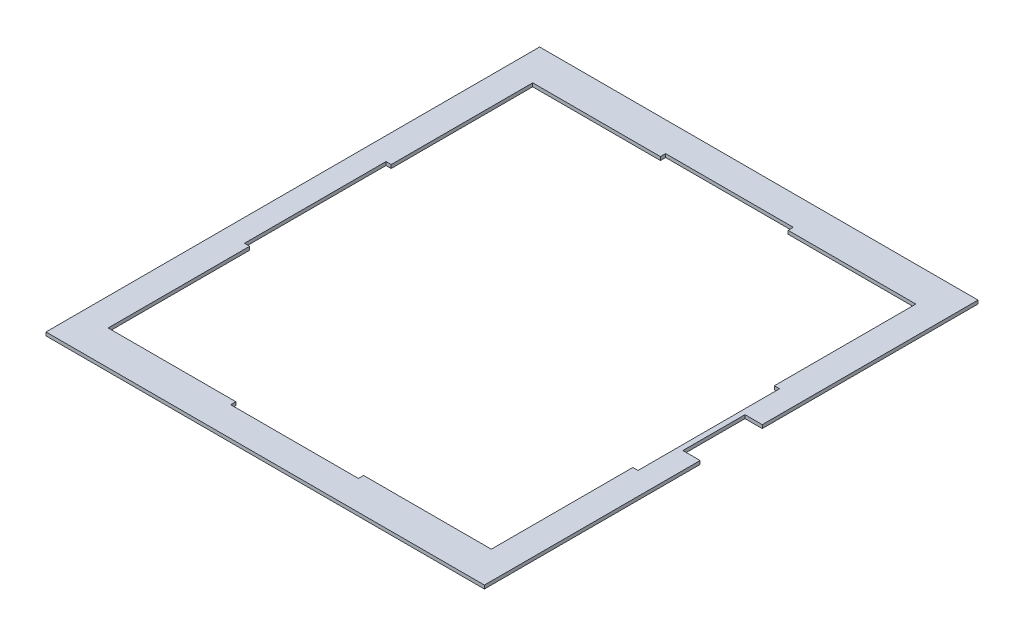
ISO-10303-21;
HEADER;
FILE_DESCRIPTION(('STEP AP214'),'2;1');
FILE_NAME('part.step','',(''),(''),'','','');
FILE_SCHEMA(('AUTOMOTIVE_DESIGN { 1 0 10303 214 1 1 1 1 }'));
ENDSEC;
DATA;
#1=APPLICATION_CONTEXT('core data for automotive mechanical design processes');
#2=APPLICATION_PROTOCOL_DEFINITION('international standard','automotive_design',2000,#1);
#3=PRODUCT_CONTEXT('',#1,'mechanical');
#4=PRODUCT('Part','Part','',(#3));
#5=PRODUCT_RELATED_PRODUCT_CATEGORY('part','',(#4));
#6=PRODUCT_DEFINITION_FORMATION('','',#4);
#7=PRODUCT_DEFINITION_CONTEXT('part definition',#1,'design');
#8=PRODUCT_DEFINITION('design','',#6,#7);
#9=PRODUCT_DEFINITION_SHAPE('','',#8);
#10=(LENGTH_UNIT() NAMED_UNIT(*) SI_UNIT(.MILLI.,.METRE.));
#11=(NAMED_UNIT(*) PLANE_ANGLE_UNIT() SI_UNIT($,.RADIAN.));
#12=(NAMED_UNIT(*) SI_UNIT($,.STERADIAN.) SOLID_ANGLE_UNIT());
#13=UNCERTAINTY_MEASURE_WITH_UNIT(LENGTH_MEASURE(1.E-05),#10,'distance_accuracy_value','');
#14=(GEOMETRIC_REPRESENTATION_CONTEXT(3) GLOBAL_UNCERTAINTY_ASSIGNED_CONTEXT((#13)) GLOBAL_UNIT_ASSIGNED_CONTEXT((#10,
#11,#12)) REPRESENTATION_CONTEXT('',''));
#15=CARTESIAN_POINT('',(0.,0.,0.));
#16=DIRECTION('',(0.,0.,1.));
#17=DIRECTION('',(1.,0.,0.));
#18=AXIS2_PLACEMENT_3D('',#15,#16,#17);
#19=CARTESIAN_POINT('',(0.,2.,0.));
#20=DIRECTION('',(0.,-1.,0.));
#21=DIRECTION('',(0.,0.,-1.));
#22=AXIS2_PLACEMENT_3D('',#19,#20,#21);
#23=PLANE('',#22);
#24=DIRECTION('',(0.,0.,-1.));
#25=VECTOR('',#24,1.);
#26=CARTESIAN_POINT('',(127.,2.,-18.));
#27=LINE('',#26,#25);
#28=CARTESIAN_POINT('',(127.,2.,-18.));
#29=VERTEX_POINT('',#28);
#30=CARTESIAN_POINT('',(127.,2.,-143.));
#31=VERTEX_POINT('',#30);
#32=EDGE_CURVE('E367',#29,#31,#27,.T.);
#33=ORIENTED_EDGE('',*,*,#32,.T.);
#34=DIRECTION('',(-1.,0.,0.));
#35=VECTOR('',#34,1.);
#36=CARTESIAN_POINT('',(-127.,2.,-143.));
#37=LINE('',#36,#35);
#38=CARTESIAN_POINT('',(-127.,2.,-143.));
#39=VERTEX_POINT('',#38);
#40=EDGE_CURVE('E370',#31,#39,#37,.T.);
#41=ORIENTED_EDGE('',*,*,#40,.T.);
#42=DIRECTION('',(0.,0.,1.));
#43=VECTOR('',#42,1.);
#44=CARTESIAN_POINT('',(-127.,2.,143.));
#45=LINE('',#44,#43);
#46=CARTESIAN_POINT('',(-127.,2.,143.));
#47=VERTEX_POINT('',#46);
#48=EDGE_CURVE('E373',#39,#47,#45,.T.);
#49=ORIENTED_EDGE('',*,*,#48,.T.);
#50=DIRECTION('',(1.,0.,0.));
#51=VECTOR('',#50,1.);
#52=CARTESIAN_POINT('',(-127.,2.,143.));
#53=LINE('',#52,#51);
#54=CARTESIAN_POINT('',(127.,2.,143.));
#55=VERTEX_POINT('',#54);
#56=EDGE_CURVE('E375',#47,#55,#53,.T.);
#57=ORIENTED_EDGE('',*,*,#56,.T.);
#58=DIRECTION('',(0.,0.,-1.));
#59=VECTOR('',#58,1.);
#60=CARTESIAN_POINT('',(127.,2.,143.));
#61=LINE('',#60,#59);
#62=CARTESIAN_POINT('',(127.,2.,18.));
#63=VERTEX_POINT('',#62);
#64=EDGE_CURVE('E377',#55,#63,#61,.T.);
#65=ORIENTED_EDGE('',*,*,#64,.T.);
#66=DIRECTION('',(-1.,0.,0.));
#67=VECTOR('',#66,1.);
#68=CARTESIAN_POINT('',(127.,2.,18.));
#69=LINE('',#68,#67);
#70=CARTESIAN_POINT('',(117.,2.,18.));
#71=VERTEX_POINT('',#70);
#72=EDGE_CURVE('E379',#63,#71,#69,.T.);
#73=ORIENTED_EDGE('',*,*,#72,.T.);
#74=DIRECTION('',(0.,0.,-1.));
#75=VECTOR('',#74,1.);
#76=CARTESIAN_POINT('',(117.,2.,18.));
#77=LINE('',#76,#75);
#78=CARTESIAN_POINT('',(117.,2.,-18.));
#79=VERTEX_POINT('',#78);
#80=EDGE_CURVE('E381',#71,#79,#77,.T.);
#81=ORIENTED_EDGE('',*,*,#80,.T.);
#82=DIRECTION('',(1.,0.,0.));
#83=VECTOR('',#82,1.);
#84=CARTESIAN_POINT('',(127.,2.,-18.));
#85=LINE('',#84,#83);
#86=EDGE_CURVE('E383',#79,#29,#85,.T.);
#87=ORIENTED_EDGE('',*,*,#86,.T.);
#88=EDGE_LOOP('',(#33,#41,#49,#57,#65,#73,#81,#87));
#89=FACE_BOUND('',#88,.T.);
#90=DIRECTION('',(0.,0.,-1.));
#91=VECTOR('',#90,1.);
#92=CARTESIAN_POINT('',(111.,2.,-41.));
#93=LINE('',#92,#91);
#94=CARTESIAN_POINT('',(111.,2.,-41.));
#95=VERTEX_POINT('',#94);
#96=CARTESIAN_POINT('',(111.,2.,-123.));
#97=VERTEX_POINT('',#96);
#98=EDGE_CURVE('E218',#95,#97,#93,.T.);
#99=ORIENTED_EDGE('',*,*,#98,.F.);
#100=DIRECTION('',(-1.,0.,0.));
#101=VECTOR('',#100,1.);
#102=CARTESIAN_POINT('',(111.,2.,-41.));
#103=LINE('',#102,#101);
#104=CARTESIAN_POINT('',(114.,2.,-41.));
#105=VERTEX_POINT('',#104);
#106=EDGE_CURVE('E275',#105,#95,#103,.T.);
#107=ORIENTED_EDGE('',*,*,#106,.F.);
#108=DIRECTION('',(0.,0.,-1.));
#109=VECTOR('',#108,1.);
#110=CARTESIAN_POINT('',(114.,2.,41.));
#111=LINE('',#110,#109);
#112=CARTESIAN_POINT('',(114.,2.,41.));
#113=VERTEX_POINT('',#112);
#114=EDGE_CURVE('E273',#113,#105,#111,.T.);
#115=ORIENTED_EDGE('',*,*,#114,.F.);
#116=DIRECTION('',(1.,0.,0.));
#117=VECTOR('',#116,1.);
#118=CARTESIAN_POINT('',(111.,2.,41.));
#119=LINE('',#118,#117);
#120=CARTESIAN_POINT('',(111.,2.,41.));
#121=VERTEX_POINT('',#120);
#122=EDGE_CURVE('E271',#121,#113,#119,.T.);
#123=ORIENTED_EDGE('',*,*,#122,.F.);
#124=DIRECTION('',(0.,0.,-1.));
#125=VECTOR('',#124,1.);
#126=CARTESIAN_POINT('',(111.,2.,123.));
#127=LINE('',#126,#125);
#128=CARTESIAN_POINT('',(111.,2.,123.));
#129=VERTEX_POINT('',#128);
#130=EDGE_CURVE('E269',#129,#121,#127,.T.);
#131=ORIENTED_EDGE('',*,*,#130,.F.);
#132=DIRECTION('',(1.,0.,0.));
#133=VECTOR('',#132,1.);
#134=CARTESIAN_POINT('',(37.,2.,123.));
#135=LINE('',#134,#133);
#136=CARTESIAN_POINT('',(37.,2.,123.));
#137=VERTEX_POINT('',#136);
#138=EDGE_CURVE('E267',#137,#129,#135,.T.);
#139=ORIENTED_EDGE('',*,*,#138,.F.);
#140=DIRECTION('',(0.,0.,-1.));
#141=VECTOR('',#140,1.);
#142=CARTESIAN_POINT('',(37.,2.,123.));
#143=LINE('',#142,#141);
#144=CARTESIAN_POINT('',(37.,2.,126.));
#145=VERTEX_POINT('',#144);
#146=EDGE_CURVE('E265',#145,#137,#143,.T.);
#147=ORIENTED_EDGE('',*,*,#146,.F.);
#148=DIRECTION('',(1.,0.,0.));
#149=VECTOR('',#148,1.);
#150=CARTESIAN_POINT('',(37.,2.,126.));
#151=LINE('',#150,#149);
#152=CARTESIAN_POINT('',(-37.,2.,126.));
#153=VERTEX_POINT('',#152);
#154=EDGE_CURVE('E263',#153,#145,#151,.T.);
#155=ORIENTED_EDGE('',*,*,#154,.F.);
#156=DIRECTION('',(0.,0.,1.));
#157=VECTOR('',#156,1.);
#158=CARTESIAN_POINT('',(-37.,2.,123.));
#159=LINE('',#158,#157);
#160=CARTESIAN_POINT('',(-37.,2.,123.));
#161=VERTEX_POINT('',#160);
#162=EDGE_CURVE('E261',#161,#153,#159,.T.);
#163=ORIENTED_EDGE('',*,*,#162,.F.);
#164=DIRECTION('',(1.,0.,0.));
#165=VECTOR('',#164,1.);
#166=CARTESIAN_POINT('',(-111.,2.,123.));
#167=LINE('',#166,#165);
#168=CARTESIAN_POINT('',(-111.,2.,123.));
#169=VERTEX_POINT('',#168);
#170=EDGE_CURVE('E259',#169,#161,#167,.T.);
#171=ORIENTED_EDGE('',*,*,#170,.F.);
#172=DIRECTION('',(0.,0.,1.));
#173=VECTOR('',#172,1.);
#174=CARTESIAN_POINT('',(-111.,2.,123.));
#175=LINE('',#174,#173);
#176=CARTESIAN_POINT('',(-111.,2.,41.));
#177=VERTEX_POINT('',#176);
#178=EDGE_CURVE('E257',#177,#169,#175,.T.);
#179=ORIENTED_EDGE('',*,*,#178,.F.);
#180=DIRECTION('',(1.,0.,0.));
#181=VECTOR('',#180,1.);
#182=CARTESIAN_POINT('',(-111.,2.,41.));
#183=LINE('',#182,#181);
#184=CARTESIAN_POINT('',(-114.,2.,41.));
#185=VERTEX_POINT('',#184);
#186=EDGE_CURVE('E255',#185,#177,#183,.T.);
#187=ORIENTED_EDGE('',*,*,#186,.F.);
#188=DIRECTION('',(0.,0.,1.));
#189=VECTOR('',#188,1.);
#190=CARTESIAN_POINT('',(-114.,2.,41.));
#191=LINE('',#190,#189);
#192=CARTESIAN_POINT('',(-114.,2.,-41.));
#193=VERTEX_POINT('',#192);
#194=EDGE_CURVE('E253',#193,#185,#191,.T.);
#195=ORIENTED_EDGE('',*,*,#194,.F.);
#196=DIRECTION('',(-1.,0.,0.));
#197=VECTOR('',#196,1.);
#198=CARTESIAN_POINT('',(-111.,2.,-41.));
#199=LINE('',#198,#197);
#200=CARTESIAN_POINT('',(-111.,2.,-41.));
#201=VERTEX_POINT('',#200);
#202=EDGE_CURVE('E251',#201,#193,#199,.T.);
#203=ORIENTED_EDGE('',*,*,#202,.F.);
#204=DIRECTION('',(0.,0.,1.));
#205=VECTOR('',#204,1.);
#206=CARTESIAN_POINT('',(-111.,2.,-41.));
#207=LINE('',#206,#205);
#208=CARTESIAN_POINT('',(-111.,2.,-123.));
#209=VERTEX_POINT('',#208);
#210=EDGE_CURVE('E249',#209,#201,#207,.T.);
#211=ORIENTED_EDGE('',*,*,#210,.F.);
#212=DIRECTION('',(-1.,0.,0.));
#213=VECTOR('',#212,1.);
#214=CARTESIAN_POINT('',(-111.,2.,-123.));
#215=LINE('',#214,#213);
#216=CARTESIAN_POINT('',(-37.,2.,-123.));
#217=VERTEX_POINT('',#216);
#218=EDGE_CURVE('E247',#217,#209,#215,.T.);
#219=ORIENTED_EDGE('',*,*,#218,.F.);
#220=DIRECTION('',(0.,0.,1.));
#221=VECTOR('',#220,1.);
#222=CARTESIAN_POINT('',(-37.,2.,-123.));
#223=LINE('',#222,#221);
#224=CARTESIAN_POINT('',(-37.,2.,-126.));
#225=VERTEX_POINT('',#224);
#226=EDGE_CURVE('E245',#225,#217,#223,.T.);
#227=ORIENTED_EDGE('',*,*,#226,.F.);
#228=DIRECTION('',(-1.,0.,0.));
#229=VECTOR('',#228,1.);
#230=CARTESIAN_POINT('',(37.,2.,-126.));
#231=LINE('',#230,#229);
#232=CARTESIAN_POINT('',(37.,2.,-126.));
#233=VERTEX_POINT('',#232);
#234=EDGE_CURVE('E241',#233,#225,#231,.T.);
#235=ORIENTED_EDGE('',*,*,#234,.F.);
#236=DIRECTION('',(0.,0.,-1.));
#237=VECTOR('',#236,1.);
#238=CARTESIAN_POINT('',(37.,2.,-123.));
#239=LINE('',#238,#237);
#240=CARTESIAN_POINT('',(37.,2.,-123.));
#241=VERTEX_POINT('',#240);
#242=EDGE_CURVE('E239',#241,#233,#239,.T.);
#243=ORIENTED_EDGE('',*,*,#242,.F.);
#244=DIRECTION('',(-1.,0.,0.));
#245=VECTOR('',#244,1.);
#246=CARTESIAN_POINT('',(37.,2.,-123.));
#247=LINE('',#246,#245);
#248=EDGE_CURVE('E226',#97,#241,#247,.T.);
#249=ORIENTED_EDGE('',*,*,#248,.F.);
#250=EDGE_LOOP('',(#99,#107,#115,#123,#131,#139,#147,#155,#163,#171,#179,#187,#195,#203,#211,
#219,#227,#235,#243,#249));
#251=FACE_BOUND('',#250,.T.);
#252=ADVANCED_FACE('F33',(#89,#251),#23,.F.);
#253=CARTESIAN_POINT('',(0.,0.,0.));
#254=DIRECTION('',(0.,-1.,0.));
#255=DIRECTION('',(0.,0.,-1.));
#256=AXIS2_PLACEMENT_3D('',#253,#254,#255);
#257=PLANE('',#256);
#258=DIRECTION('',(0.,0.,-1.));
#259=VECTOR('',#258,1.);
#260=CARTESIAN_POINT('',(127.,0.,-18.));
#261=LINE('',#260,#259);
#262=CARTESIAN_POINT('',(127.,0.,-18.));
#263=VERTEX_POINT('',#262);
#264=CARTESIAN_POINT('',(127.,0.,-143.));
#265=VERTEX_POINT('',#264);
#266=EDGE_CURVE('E234',#263,#265,#261,.T.);
#267=ORIENTED_EDGE('',*,*,#266,.F.);
#268=DIRECTION('',(1.,0.,0.));
#269=VECTOR('',#268,1.);
#270=CARTESIAN_POINT('',(127.,0.,-18.));
#271=LINE('',#270,#269);
#272=CARTESIAN_POINT('',(117.,0.,-18.));
#273=VERTEX_POINT('',#272);
#274=EDGE_CURVE('E371',#273,#263,#271,.T.);
#275=ORIENTED_EDGE('',*,*,#274,.F.);
#276=DIRECTION('',(0.,0.,-1.));
#277=VECTOR('',#276,1.);
#278=CARTESIAN_POINT('',(117.,0.,18.));
#279=LINE('',#278,#277);
#280=CARTESIAN_POINT('',(117.,0.,18.));
#281=VERTEX_POINT('',#280);
#282=EDGE_CURVE('E398',#281,#273,#279,.T.);
#283=ORIENTED_EDGE('',*,*,#282,.F.);
#284=DIRECTION('',(-1.,0.,0.));
#285=VECTOR('',#284,1.);
#286=CARTESIAN_POINT('',(127.,0.,18.));
#287=LINE('',#286,#285);
#288=CARTESIAN_POINT('',(127.,0.,18.));
#289=VERTEX_POINT('',#288);
#290=EDGE_CURVE('E396',#289,#281,#287,.T.);
#291=ORIENTED_EDGE('',*,*,#290,.F.);
#292=DIRECTION('',(0.,0.,-1.));
#293=VECTOR('',#292,1.);
#294=CARTESIAN_POINT('',(127.,0.,143.));
#295=LINE('',#294,#293);
#296=CARTESIAN_POINT('',(127.,0.,143.));
#297=VERTEX_POINT('',#296);
#298=EDGE_CURVE('E394',#297,#289,#295,.T.);
#299=ORIENTED_EDGE('',*,*,#298,.F.);
#300=DIRECTION('',(1.,0.,0.));
#301=VECTOR('',#300,1.);
#302=CARTESIAN_POINT('',(-127.,0.,143.));
#303=LINE('',#302,#301);
#304=CARTESIAN_POINT('',(-127.,0.,143.));
#305=VERTEX_POINT('',#304);
#306=EDGE_CURVE('E392',#305,#297,#303,.T.);
#307=ORIENTED_EDGE('',*,*,#306,.F.);
#308=DIRECTION('',(0.,0.,1.));
#309=VECTOR('',#308,1.);
#310=CARTESIAN_POINT('',(-127.,0.,143.));
#311=LINE('',#310,#309);
#312=CARTESIAN_POINT('',(-127.,0.,-143.));
#313=VERTEX_POINT('',#312);
#314=EDGE_CURVE('E390',#313,#305,#311,.T.);
#315=ORIENTED_EDGE('',*,*,#314,.F.);
#316=DIRECTION('',(-1.,0.,0.));
#317=VECTOR('',#316,1.);
#318=CARTESIAN_POINT('',(-127.,0.,-143.));
#319=LINE('',#318,#317);
#320=EDGE_CURVE('E388',#265,#313,#319,.T.);
#321=ORIENTED_EDGE('',*,*,#320,.F.);
#322=EDGE_LOOP('',(#267,#275,#283,#291,#299,#307,#315,#321));
#323=FACE_BOUND('',#322,.T.);
#324=DIRECTION('',(-1.,0.,0.));
#325=VECTOR('',#324,1.);
#326=CARTESIAN_POINT('',(111.,0.,-41.));
#327=LINE('',#326,#325);
#328=CARTESIAN_POINT('',(114.,0.,-41.));
#329=VERTEX_POINT('',#328);
#330=CARTESIAN_POINT('',(111.,0.,-41.));
#331=VERTEX_POINT('',#330);
#332=EDGE_CURVE('E227',#329,#331,#327,.T.);
#333=ORIENTED_EDGE('',*,*,#332,.T.);
#334=DIRECTION('',(0.,0.,-1.));
#335=VECTOR('',#334,1.);
#336=CARTESIAN_POINT('',(111.,0.,-41.));
#337=LINE('',#336,#335);
#338=CARTESIAN_POINT('',(111.,0.,-123.));
#339=VERTEX_POINT('',#338);
#340=EDGE_CURVE('E56',#331,#339,#337,.T.);
#341=ORIENTED_EDGE('',*,*,#340,.T.);
#342=DIRECTION('',(-1.,0.,0.));
#343=VECTOR('',#342,1.);
#344=CARTESIAN_POINT('',(37.,0.,-123.));
#345=LINE('',#344,#343);
#346=CARTESIAN_POINT('',(37.,0.,-123.));
#347=VERTEX_POINT('',#346);
#348=EDGE_CURVE('E233',#339,#347,#345,.T.);
#349=ORIENTED_EDGE('',*,*,#348,.T.);
#350=DIRECTION('',(0.,0.,-1.));
#351=VECTOR('',#350,1.);
#352=CARTESIAN_POINT('',(37.,0.,-123.));
#353=LINE('',#352,#351);
#354=CARTESIAN_POINT('',(37.,0.,-126.));
#355=VERTEX_POINT('',#354);
#356=EDGE_CURVE('E279',#347,#355,#353,.T.);
#357=ORIENTED_EDGE('',*,*,#356,.T.);
#358=DIRECTION('',(-1.,0.,0.));
#359=VECTOR('',#358,1.);
#360=CARTESIAN_POINT('',(37.,0.,-126.));
#361=LINE('',#360,#359);
#362=CARTESIAN_POINT('',(-37.,0.,-126.));
#363=VERTEX_POINT('',#362);
#364=EDGE_CURVE('E282',#355,#363,#361,.T.);
#365=ORIENTED_EDGE('',*,*,#364,.T.);
#366=DIRECTION('',(0.,0.,1.));
#367=VECTOR('',#366,1.);
#368=CARTESIAN_POINT('',(-37.,0.,-123.));
#369=LINE('',#368,#367);
#370=CARTESIAN_POINT('',(-37.,0.,-123.));
#371=VERTEX_POINT('',#370);
#372=EDGE_CURVE('E285',#363,#371,#369,.T.);
#373=ORIENTED_EDGE('',*,*,#372,.T.);
#374=DIRECTION('',(-1.,0.,0.));
#375=VECTOR('',#374,1.);
#376=CARTESIAN_POINT('',(-111.,0.,-123.));
#377=LINE('',#376,#375);
#378=CARTESIAN_POINT('',(-111.,0.,-123.));
#379=VERTEX_POINT('',#378);
#380=EDGE_CURVE('E288',#371,#379,#377,.T.);
#381=ORIENTED_EDGE('',*,*,#380,.T.);
#382=DIRECTION('',(0.,0.,1.));
#383=VECTOR('',#382,1.);
#384=CARTESIAN_POINT('',(-111.,0.,-41.));
#385=LINE('',#384,#383);
#386=CARTESIAN_POINT('',(-111.,0.,-41.));
#387=VERTEX_POINT('',#386);
#388=EDGE_CURVE('E291',#379,#387,#385,.T.);
#389=ORIENTED_EDGE('',*,*,#388,.T.);
#390=DIRECTION('',(-1.,0.,0.));
#391=VECTOR('',#390,1.);
#392=CARTESIAN_POINT('',(-111.,0.,-41.));
#393=LINE('',#392,#391);
#394=CARTESIAN_POINT('',(-114.,0.,-41.));
#395=VERTEX_POINT('',#394);
#396=EDGE_CURVE('E294',#387,#395,#393,.T.);
#397=ORIENTED_EDGE('',*,*,#396,.T.);
#398=DIRECTION('',(0.,0.,1.));
#399=VECTOR('',#398,1.);
#400=CARTESIAN_POINT('',(-114.,0.,41.));
#401=LINE('',#400,#399);
#402=CARTESIAN_POINT('',(-114.,0.,41.));
#403=VERTEX_POINT('',#402);
#404=EDGE_CURVE('E297',#395,#403,#401,.T.);
#405=ORIENTED_EDGE('',*,*,#404,.T.);
#406=DIRECTION('',(1.,0.,0.));
#407=VECTOR('',#406,1.);
#408=CARTESIAN_POINT('',(-111.,0.,41.));
#409=LINE('',#408,#407);
#410=CARTESIAN_POINT('',(-111.,0.,41.));
#411=VERTEX_POINT('',#410);
#412=EDGE_CURVE('E300',#403,#411,#409,.T.);
#413=ORIENTED_EDGE('',*,*,#412,.T.);
#414=DIRECTION('',(0.,0.,1.));
#415=VECTOR('',#414,1.);
#416=CARTESIAN_POINT('',(-111.,0.,123.));
#417=LINE('',#416,#415);
#418=CARTESIAN_POINT('',(-111.,0.,123.));
#419=VERTEX_POINT('',#418);
#420=EDGE_CURVE('E303',#411,#419,#417,.T.);
#421=ORIENTED_EDGE('',*,*,#420,.T.);
#422=DIRECTION('',(1.,0.,0.));
#423=VECTOR('',#422,1.);
#424=CARTESIAN_POINT('',(-111.,0.,123.));
#425=LINE('',#424,#423);
#426=CARTESIAN_POINT('',(-37.,0.,123.));
#427=VERTEX_POINT('',#426);
#428=EDGE_CURVE('E306',#419,#427,#425,.T.);
#429=ORIENTED_EDGE('',*,*,#428,.T.);
#430=DIRECTION('',(0.,0.,1.));
#431=VECTOR('',#430,1.);
#432=CARTESIAN_POINT('',(-37.,0.,123.));
#433=LINE('',#432,#431);
#434=CARTESIAN_POINT('',(-37.,0.,126.));
#435=VERTEX_POINT('',#434);
#436=EDGE_CURVE('E309',#427,#435,#433,.T.);
#437=ORIENTED_EDGE('',*,*,#436,.T.);
#438=DIRECTION('',(1.,0.,0.));
#439=VECTOR('',#438,1.);
#440=CARTESIAN_POINT('',(37.,0.,126.));
#441=LINE('',#440,#439);
#442=CARTESIAN_POINT('',(37.,0.,126.));
#443=VERTEX_POINT('',#442);
#444=EDGE_CURVE('E312',#435,#443,#441,.T.);
#445=ORIENTED_EDGE('',*,*,#444,.T.);
#446=DIRECTION('',(0.,0.,-1.));
#447=VECTOR('',#446,1.);
#448=CARTESIAN_POINT('',(37.,0.,123.));
#449=LINE('',#448,#447);
#450=CARTESIAN_POINT('',(37.,0.,123.));
#451=VERTEX_POINT('',#450);
#452=EDGE_CURVE('E315',#443,#451,#449,.T.);
#453=ORIENTED_EDGE('',*,*,#452,.T.);
#454=DIRECTION('',(1.,0.,0.));
#455=VECTOR('',#454,1.);
#456=CARTESIAN_POINT('',(37.,0.,123.));
#457=LINE('',#456,#455);
#458=CARTESIAN_POINT('',(111.,0.,123.));
#459=VERTEX_POINT('',#458);
#460=EDGE_CURVE('E318',#451,#459,#457,.T.);
#461=ORIENTED_EDGE('',*,*,#460,.T.);
#462=DIRECTION('',(0.,0.,-1.));
#463=VECTOR('',#462,1.);
#464=CARTESIAN_POINT('',(111.,0.,123.));
#465=LINE('',#464,#463);
#466=CARTESIAN_POINT('',(111.,0.,41.));
#467=VERTEX_POINT('',#466);
#468=EDGE_CURVE('E321',#459,#467,#465,.T.);
#469=ORIENTED_EDGE('',*,*,#468,.T.);
#470=DIRECTION('',(1.,0.,0.));
#471=VECTOR('',#470,1.);
#472=CARTESIAN_POINT('',(111.,0.,41.));
#473=LINE('',#472,#471);
#474=CARTESIAN_POINT('',(114.,0.,41.));
#475=VERTEX_POINT('',#474);
#476=EDGE_CURVE('E324',#467,#475,#473,.T.);
#477=ORIENTED_EDGE('',*,*,#476,.T.);
#478=DIRECTION('',(0.,0.,-1.));
#479=VECTOR('',#478,1.);
#480=CARTESIAN_POINT('',(114.,0.,41.));
#481=LINE('',#480,#479);
#482=EDGE_CURVE('E327',#475,#329,#481,.T.);
#483=ORIENTED_EDGE('',*,*,#482,.T.);
#484=EDGE_LOOP('',(#333,#341,#349,#357,#365,#373,#381,#389,#397,#405,#413,#421,#429,#437,#445,
#453,#461,#469,#477,#483));
#485=FACE_BOUND('',#484,.T.);
#486=ADVANCED_FACE('F428',(#323,#485),#257,.T.);
#487=CARTESIAN_POINT('',(127.,2.,-18.));
#488=DIRECTION('',(-1.,0.,0.));
#489=DIRECTION('',(0.,0.,1.));
#490=AXIS2_PLACEMENT_3D('',#487,#488,#489);
#491=PLANE('',#490);
#492=ORIENTED_EDGE('',*,*,#266,.T.);
#493=DIRECTION('',(0.,-1.,0.));
#494=VECTOR('',#493,1.);
#495=CARTESIAN_POINT('',(127.,2.,-143.));
#496=LINE('',#495,#494);
#497=EDGE_CURVE('E11',#31,#265,#496,.T.);
#498=ORIENTED_EDGE('',*,*,#497,.F.);
#499=ORIENTED_EDGE('',*,*,#32,.F.);
#500=DIRECTION('',(0.,-1.,0.));
#501=VECTOR('',#500,1.);
#502=CARTESIAN_POINT('',(127.,2.,-18.));
#503=LINE('',#502,#501);
#504=EDGE_CURVE('E385',#29,#263,#503,.T.);
#505=ORIENTED_EDGE('',*,*,#504,.T.);
#506=EDGE_LOOP('',(#492,#498,#499,#505));
#507=FACE_BOUND('',#506,.T.);
#508=ADVANCED_FACE('F35',(#507),#491,.F.);
#509=CARTESIAN_POINT('',(-127.,2.,-143.));
#510=DIRECTION('',(0.,0.,1.));
#511=DIRECTION('',(1.,0.,0.));
#512=AXIS2_PLACEMENT_3D('',#509,#510,#511);
#513=PLANE('',#512);
#514=ORIENTED_EDGE('',*,*,#320,.T.);
#515=DIRECTION('',(0.,-1.,0.));
#516=VECTOR('',#515,1.);
#517=CARTESIAN_POINT('',(-127.,2.,-143.));
#518=LINE('',#517,#516);
#519=EDGE_CURVE('E41',#39,#313,#518,.T.);
#520=ORIENTED_EDGE('',*,*,#519,.F.);
#521=ORIENTED_EDGE('',*,*,#40,.F.);
#522=ORIENTED_EDGE('',*,*,#497,.T.);
#523=EDGE_LOOP('',(#514,#520,#521,#522));
#524=FACE_BOUND('',#523,.T.);
#525=ADVANCED_FACE('F445',(#524),#513,.F.);
#526=CARTESIAN_POINT('',(-127.,2.,143.));
#527=DIRECTION('',(1.,0.,0.));
#528=DIRECTION('',(0.,0.,-1.));
#529=AXIS2_PLACEMENT_3D('',#526,#527,#528);
#530=PLANE('',#529);
#531=ORIENTED_EDGE('',*,*,#314,.T.);
#532=DIRECTION('',(0.,-1.,0.));
#533=VECTOR('',#532,1.);
#534=CARTESIAN_POINT('',(-127.,2.,143.));
#535=LINE('',#534,#533);
#536=EDGE_CURVE('E415',#47,#305,#535,.T.);
#537=ORIENTED_EDGE('',*,*,#536,.F.);
#538=ORIENTED_EDGE('',*,*,#48,.F.);
#539=ORIENTED_EDGE('',*,*,#519,.T.);
#540=EDGE_LOOP('',(#531,#537,#538,#539));
#541=FACE_BOUND('',#540,.T.);
#542=ADVANCED_FACE('F422',(#541),#530,.F.);
#543=CARTESIAN_POINT('',(-127.,2.,143.));
#544=DIRECTION('',(0.,0.,-1.));
#545=DIRECTION('',(-1.,0.,0.));
#546=AXIS2_PLACEMENT_3D('',#543,#544,#545);
#547=PLANE('',#546);
#548=ORIENTED_EDGE('',*,*,#306,.T.);
#549=DIRECTION('',(0.,-1.,0.));
#550=VECTOR('',#549,1.);
#551=CARTESIAN_POINT('',(127.,2.,143.));
#552=LINE('',#551,#550);
#553=EDGE_CURVE('E412',#55,#297,#552,.T.);
#554=ORIENTED_EDGE('',*,*,#553,.F.);
#555=ORIENTED_EDGE('',*,*,#56,.F.);
#556=ORIENTED_EDGE('',*,*,#536,.T.);
#557=EDGE_LOOP('',(#548,#554,#555,#556));
#558=FACE_BOUND('',#557,.T.);
#559=ADVANCED_FACE('F434',(#558),#547,.F.);
#560=CARTESIAN_POINT('',(127.,2.,143.));
#561=DIRECTION('',(-1.,0.,0.));
#562=DIRECTION('',(0.,0.,1.));
#563=AXIS2_PLACEMENT_3D('',#560,#561,#562);
#564=PLANE('',#563);
#565=ORIENTED_EDGE('',*,*,#298,.T.);
#566=DIRECTION('',(0.,-1.,0.));
#567=VECTOR('',#566,1.);
#568=CARTESIAN_POINT('',(127.,2.,18.));
#569=LINE('',#568,#567);
#570=EDGE_CURVE('E409',#63,#289,#569,.T.);
#571=ORIENTED_EDGE('',*,*,#570,.F.);
#572=ORIENTED_EDGE('',*,*,#64,.F.);
#573=ORIENTED_EDGE('',*,*,#553,.T.);
#574=EDGE_LOOP('',(#565,#571,#572,#573));
#575=FACE_BOUND('',#574,.T.);
#576=ADVANCED_FACE('F438',(#575),#564,.F.);
#577=CARTESIAN_POINT('',(127.,2.,18.));
#578=DIRECTION('',(0.,0.,1.));
#579=DIRECTION('',(1.,0.,0.));
#580=AXIS2_PLACEMENT_3D('',#577,#578,#579);
#581=PLANE('',#580);
#582=ORIENTED_EDGE('',*,*,#290,.T.);
#583=DIRECTION('',(0.,-1.,0.));
#584=VECTOR('',#583,1.);
#585=CARTESIAN_POINT('',(117.,2.,18.));
#586=LINE('',#585,#584);
#587=EDGE_CURVE('E406',#71,#281,#586,.T.);
#588=ORIENTED_EDGE('',*,*,#587,.F.);
#589=ORIENTED_EDGE('',*,*,#72,.F.);
#590=ORIENTED_EDGE('',*,*,#570,.T.);
#591=EDGE_LOOP('',(#582,#588,#589,#590));
#592=FACE_BOUND('',#591,.T.);
#593=ADVANCED_FACE('F458',(#592),#581,.F.);
#594=CARTESIAN_POINT('',(117.,2.,18.));
#595=DIRECTION('',(-1.,0.,0.));
#596=DIRECTION('',(0.,0.,1.));
#597=AXIS2_PLACEMENT_3D('',#594,#595,#596);
#598=PLANE('',#597);
#599=ORIENTED_EDGE('',*,*,#282,.T.);
#600=DIRECTION('',(0.,-1.,0.));
#601=VECTOR('',#600,1.);
#602=CARTESIAN_POINT('',(117.,2.,-18.));
#603=LINE('',#602,#601);
#604=EDGE_CURVE('E403',#79,#273,#603,.T.);
#605=ORIENTED_EDGE('',*,*,#604,.F.);
#606=ORIENTED_EDGE('',*,*,#80,.F.);
#607=ORIENTED_EDGE('',*,*,#587,.T.);
#608=EDGE_LOOP('',(#599,#605,#606,#607));
#609=FACE_BOUND('',#608,.T.);
#610=ADVANCED_FACE('F456',(#609),#598,.F.);
#611=CARTESIAN_POINT('',(127.,2.,-18.));
#612=DIRECTION('',(0.,0.,-1.));
#613=DIRECTION('',(-1.,0.,0.));
#614=AXIS2_PLACEMENT_3D('',#611,#612,#613);
#615=PLANE('',#614);
#616=ORIENTED_EDGE('',*,*,#274,.T.);
#617=ORIENTED_EDGE('',*,*,#504,.F.);
#618=ORIENTED_EDGE('',*,*,#86,.F.);
#619=ORIENTED_EDGE('',*,*,#604,.T.);
#620=EDGE_LOOP('',(#616,#617,#618,#619));
#621=FACE_BOUND('',#620,.T.);
#622=ADVANCED_FACE('F451',(#621),#615,.F.);
#623=CARTESIAN_POINT('',(111.,2.,-41.));
#624=DIRECTION('',(-1.,0.,0.));
#625=DIRECTION('',(0.,0.,1.));
#626=AXIS2_PLACEMENT_3D('',#623,#624,#625);
#627=PLANE('',#626);
#628=ORIENTED_EDGE('',*,*,#340,.F.);
#629=DIRECTION('',(0.,-1.,0.));
#630=VECTOR('',#629,1.);
#631=CARTESIAN_POINT('',(111.,2.,-41.));
#632=LINE('',#631,#630);
#633=EDGE_CURVE('E222',#95,#331,#632,.T.);
#634=ORIENTED_EDGE('',*,*,#633,.F.);
#635=ORIENTED_EDGE('',*,*,#98,.T.);
#636=DIRECTION('',(0.,-1.,0.));
#637=VECTOR('',#636,1.);
#638=CARTESIAN_POINT('',(111.,2.,-123.));
#639=LINE('',#638,#637);
#640=EDGE_CURVE('E221',#97,#339,#639,.T.);
#641=ORIENTED_EDGE('',*,*,#640,.T.);
#642=EDGE_LOOP('',(#628,#634,#635,#641));
#643=FACE_BOUND('',#642,.T.);
#644=ADVANCED_FACE('F220',(#643),#627,.T.);
#645=CARTESIAN_POINT('',(37.,2.,-123.));
#646=DIRECTION('',(0.,0.,1.));
#647=DIRECTION('',(1.,0.,0.));
#648=AXIS2_PLACEMENT_3D('',#645,#646,#647);
#649=PLANE('',#648);
#650=ORIENTED_EDGE('',*,*,#348,.F.);
#651=ORIENTED_EDGE('',*,*,#640,.F.);
#652=ORIENTED_EDGE('',*,*,#248,.T.);
#653=DIRECTION('',(0.,-1.,0.));
#654=VECTOR('',#653,1.);
#655=CARTESIAN_POINT('',(37.,2.,-123.));
#656=LINE('',#655,#654);
#657=EDGE_CURVE('E235',#241,#347,#656,.T.);
#658=ORIENTED_EDGE('',*,*,#657,.T.);
#659=EDGE_LOOP('',(#650,#651,#652,#658));
#660=FACE_BOUND('',#659,.T.);
#661=ADVANCED_FACE('F230',(#660),#649,.T.);
#662=CARTESIAN_POINT('',(37.,2.,-123.));
#663=DIRECTION('',(-1.,0.,0.));
#664=DIRECTION('',(0.,0.,1.));
#665=AXIS2_PLACEMENT_3D('',#662,#663,#664);
#666=PLANE('',#665);
#667=ORIENTED_EDGE('',*,*,#356,.F.);
#668=ORIENTED_EDGE('',*,*,#657,.F.);
#669=ORIENTED_EDGE('',*,*,#242,.T.);
#670=DIRECTION('',(0.,-1.,0.));
#671=VECTOR('',#670,1.);
#672=CARTESIAN_POINT('',(37.,2.,-126.));
#673=LINE('',#672,#671);
#674=EDGE_CURVE('E364',#233,#355,#673,.T.);
#675=ORIENTED_EDGE('',*,*,#674,.T.);
#676=EDGE_LOOP('',(#667,#668,#669,#675));
#677=FACE_BOUND('',#676,.T.);
#678=ADVANCED_FACE('F483',(#677),#666,.T.);
#679=CARTESIAN_POINT('',(37.,2.,-126.));
#680=DIRECTION('',(0.,0.,1.));
#681=DIRECTION('',(1.,0.,0.));
#682=AXIS2_PLACEMENT_3D('',#679,#680,#681);
#683=PLANE('',#682);
#684=ORIENTED_EDGE('',*,*,#364,.F.);
#685=ORIENTED_EDGE('',*,*,#674,.F.);
#686=ORIENTED_EDGE('',*,*,#234,.T.);
#687=DIRECTION('',(0.,-1.,0.));
#688=VECTOR('',#687,1.);
#689=CARTESIAN_POINT('',(-37.,2.,-126.));
#690=LINE('',#689,#688);
#691=EDGE_CURVE('E362',#225,#363,#690,.T.);
#692=ORIENTED_EDGE('',*,*,#691,.T.);
#693=EDGE_LOOP('',(#684,#685,#686,#692));
#694=FACE_BOUND('',#693,.T.);
#695=ADVANCED_FACE('F487',(#694),#683,.T.);
#696=CARTESIAN_POINT('',(-37.,2.,-123.));
#697=DIRECTION('',(1.,0.,0.));
#698=DIRECTION('',(0.,0.,-1.));
#699=AXIS2_PLACEMENT_3D('',#696,#697,#698);
#700=PLANE('',#699);
#701=ORIENTED_EDGE('',*,*,#372,.F.);
#702=ORIENTED_EDGE('',*,*,#691,.F.);
#703=ORIENTED_EDGE('',*,*,#226,.T.);
#704=DIRECTION('',(0.,-1.,0.));
#705=VECTOR('',#704,1.);
#706=CARTESIAN_POINT('',(-37.,2.,-123.));
#707=LINE('',#706,#705);
#708=EDGE_CURVE('E360',#217,#371,#707,.T.);
#709=ORIENTED_EDGE('',*,*,#708,.T.);
#710=EDGE_LOOP('',(#701,#702,#703,#709));
#711=FACE_BOUND('',#710,.T.);
#712=ADVANCED_FACE('F493',(#711),#700,.T.);
#713=CARTESIAN_POINT('',(-111.,2.,-123.));
#714=DIRECTION('',(0.,0.,1.));
#715=DIRECTION('',(1.,0.,0.));
#716=AXIS2_PLACEMENT_3D('',#713,#714,#715);
#717=PLANE('',#716);
#718=ORIENTED_EDGE('',*,*,#380,.F.);
#719=ORIENTED_EDGE('',*,*,#708,.F.);
#720=ORIENTED_EDGE('',*,*,#218,.T.);
#721=DIRECTION('',(0.,-1.,0.));
#722=VECTOR('',#721,1.);
#723=CARTESIAN_POINT('',(-111.,2.,-123.));
#724=LINE('',#723,#722);
#725=EDGE_CURVE('E358',#209,#379,#724,.T.);
#726=ORIENTED_EDGE('',*,*,#725,.T.);
#727=EDGE_LOOP('',(#718,#719,#720,#726));
#728=FACE_BOUND('',#727,.T.);
#729=ADVANCED_FACE('F497',(#728),#717,.T.);
#730=CARTESIAN_POINT('',(-111.,2.,-41.));
#731=DIRECTION('',(1.,0.,0.));
#732=DIRECTION('',(0.,0.,-1.));
#733=AXIS2_PLACEMENT_3D('',#730,#731,#732);
#734=PLANE('',#733);
#735=ORIENTED_EDGE('',*,*,#388,.F.);
#736=ORIENTED_EDGE('',*,*,#725,.F.);
#737=ORIENTED_EDGE('',*,*,#210,.T.);
#738=DIRECTION('',(0.,-1.,0.));
#739=VECTOR('',#738,1.);
#740=CARTESIAN_POINT('',(-111.,2.,-41.));
#741=LINE('',#740,#739);
#742=EDGE_CURVE('E356',#201,#387,#741,.T.);
#743=ORIENTED_EDGE('',*,*,#742,.T.);
#744=EDGE_LOOP('',(#735,#736,#737,#743));
#745=FACE_BOUND('',#744,.T.);
#746=ADVANCED_FACE('F501',(#745),#734,.T.);
#747=CARTESIAN_POINT('',(-111.,2.,-41.));
#748=DIRECTION('',(0.,0.,1.));
#749=DIRECTION('',(1.,0.,0.));
#750=AXIS2_PLACEMENT_3D('',#747,#748,#749);
#751=PLANE('',#750);
#752=ORIENTED_EDGE('',*,*,#396,.F.);
#753=ORIENTED_EDGE('',*,*,#742,.F.);
#754=ORIENTED_EDGE('',*,*,#202,.T.);
#755=DIRECTION('',(0.,-1.,0.));
#756=VECTOR('',#755,1.);
#757=CARTESIAN_POINT('',(-114.,2.,-41.));
#758=LINE('',#757,#756);
#759=EDGE_CURVE('E354',#193,#395,#758,.T.);
#760=ORIENTED_EDGE('',*,*,#759,.T.);
#761=EDGE_LOOP('',(#752,#753,#754,#760));
#762=FACE_BOUND('',#761,.T.);
#763=ADVANCED_FACE('F505',(#762),#751,.T.);
#764=CARTESIAN_POINT('',(-114.,2.,41.));
#765=DIRECTION('',(1.,0.,0.));
#766=DIRECTION('',(0.,0.,-1.));
#767=AXIS2_PLACEMENT_3D('',#764,#765,#766);
#768=PLANE('',#767);
#769=ORIENTED_EDGE('',*,*,#404,.F.);
#770=ORIENTED_EDGE('',*,*,#759,.F.);
#771=ORIENTED_EDGE('',*,*,#194,.T.);
#772=DIRECTION('',(0.,-1.,0.));
#773=VECTOR('',#772,1.);
#774=CARTESIAN_POINT('',(-114.,2.,41.));
#775=LINE('',#774,#773);
#776=EDGE_CURVE('E352',#185,#403,#775,.T.);
#777=ORIENTED_EDGE('',*,*,#776,.T.);
#778=EDGE_LOOP('',(#769,#770,#771,#777));
#779=FACE_BOUND('',#778,.T.);
#780=ADVANCED_FACE('F509',(#779),#768,.T.);
#781=CARTESIAN_POINT('',(-111.,2.,41.));
#782=DIRECTION('',(0.,0.,-1.));
#783=DIRECTION('',(-1.,0.,0.));
#784=AXIS2_PLACEMENT_3D('',#781,#782,#783);
#785=PLANE('',#784);
#786=ORIENTED_EDGE('',*,*,#412,.F.);
#787=ORIENTED_EDGE('',*,*,#776,.F.);
#788=ORIENTED_EDGE('',*,*,#186,.T.);
#789=DIRECTION('',(0.,-1.,0.));
#790=VECTOR('',#789,1.);
#791=CARTESIAN_POINT('',(-111.,2.,41.));
#792=LINE('',#791,#790);
#793=EDGE_CURVE('E350',#177,#411,#792,.T.);
#794=ORIENTED_EDGE('',*,*,#793,.T.);
#795=EDGE_LOOP('',(#786,#787,#788,#794));
#796=FACE_BOUND('',#795,.T.);
#797=ADVANCED_FACE('F513',(#796),#785,.T.);
#798=CARTESIAN_POINT('',(-111.,2.,123.));
#799=DIRECTION('',(1.,0.,0.));
#800=DIRECTION('',(0.,0.,-1.));
#801=AXIS2_PLACEMENT_3D('',#798,#799,#800);
#802=PLANE('',#801);
#803=ORIENTED_EDGE('',*,*,#420,.F.);
#804=ORIENTED_EDGE('',*,*,#793,.F.);
#805=ORIENTED_EDGE('',*,*,#178,.T.);
#806=DIRECTION('',(0.,-1.,0.));
#807=VECTOR('',#806,1.);
#808=CARTESIAN_POINT('',(-111.,2.,123.));
#809=LINE('',#808,#807);
#810=EDGE_CURVE('E348',#169,#419,#809,.T.);
#811=ORIENTED_EDGE('',*,*,#810,.T.);
#812=EDGE_LOOP('',(#803,#804,#805,#811));
#813=FACE_BOUND('',#812,.T.);
#814=ADVANCED_FACE('F517',(#813),#802,.T.);
#815=CARTESIAN_POINT('',(-111.,2.,123.));
#816=DIRECTION('',(0.,0.,-1.));
#817=DIRECTION('',(-1.,0.,0.));
#818=AXIS2_PLACEMENT_3D('',#815,#816,#817);
#819=PLANE('',#818);
#820=ORIENTED_EDGE('',*,*,#428,.F.);
#821=ORIENTED_EDGE('',*,*,#810,.F.);
#822=ORIENTED_EDGE('',*,*,#170,.T.);
#823=DIRECTION('',(0.,-1.,0.));
#824=VECTOR('',#823,1.);
#825=CARTESIAN_POINT('',(-37.,2.,123.));
#826=LINE('',#825,#824);
#827=EDGE_CURVE('E346',#161,#427,#826,.T.);
#828=ORIENTED_EDGE('',*,*,#827,.T.);
#829=EDGE_LOOP('',(#820,#821,#822,#828));
#830=FACE_BOUND('',#829,.T.);
#831=ADVANCED_FACE('F521',(#830),#819,.T.);
#832=CARTESIAN_POINT('',(-37.,2.,123.));
#833=DIRECTION('',(1.,0.,0.));
#834=DIRECTION('',(0.,0.,-1.));
#835=AXIS2_PLACEMENT_3D('',#832,#833,#834);
#836=PLANE('',#835);
#837=ORIENTED_EDGE('',*,*,#436,.F.);
#838=ORIENTED_EDGE('',*,*,#827,.F.);
#839=ORIENTED_EDGE('',*,*,#162,.T.);
#840=DIRECTION('',(0.,-1.,0.));
#841=VECTOR('',#840,1.);
#842=CARTESIAN_POINT('',(-37.,2.,126.));
#843=LINE('',#842,#841);
#844=EDGE_CURVE('E344',#153,#435,#843,.T.);
#845=ORIENTED_EDGE('',*,*,#844,.T.);
#846=EDGE_LOOP('',(#837,#838,#839,#845));
#847=FACE_BOUND('',#846,.T.);
#848=ADVANCED_FACE('F525',(#847),#836,.T.);
#849=CARTESIAN_POINT('',(37.,2.,126.));
#850=DIRECTION('',(0.,0.,-1.));
#851=DIRECTION('',(-1.,0.,0.));
#852=AXIS2_PLACEMENT_3D('',#849,#850,#851);
#853=PLANE('',#852);
#854=ORIENTED_EDGE('',*,*,#444,.F.);
#855=ORIENTED_EDGE('',*,*,#844,.F.);
#856=ORIENTED_EDGE('',*,*,#154,.T.);
#857=DIRECTION('',(0.,-1.,0.));
#858=VECTOR('',#857,1.);
#859=CARTESIAN_POINT('',(37.,2.,126.));
#860=LINE('',#859,#858);
#861=EDGE_CURVE('E342',#145,#443,#860,.T.);
#862=ORIENTED_EDGE('',*,*,#861,.T.);
#863=EDGE_LOOP('',(#854,#855,#856,#862));
#864=FACE_BOUND('',#863,.T.);
#865=ADVANCED_FACE('F529',(#864),#853,.T.);
#866=CARTESIAN_POINT('',(37.,2.,123.));
#867=DIRECTION('',(-1.,0.,0.));
#868=DIRECTION('',(0.,0.,1.));
#869=AXIS2_PLACEMENT_3D('',#866,#867,#868);
#870=PLANE('',#869);
#871=ORIENTED_EDGE('',*,*,#452,.F.);
#872=ORIENTED_EDGE('',*,*,#861,.F.);
#873=ORIENTED_EDGE('',*,*,#146,.T.);
#874=DIRECTION('',(0.,-1.,0.));
#875=VECTOR('',#874,1.);
#876=CARTESIAN_POINT('',(37.,2.,123.));
#877=LINE('',#876,#875);
#878=EDGE_CURVE('E340',#137,#451,#877,.T.);
#879=ORIENTED_EDGE('',*,*,#878,.T.);
#880=EDGE_LOOP('',(#871,#872,#873,#879));
#881=FACE_BOUND('',#880,.T.);
#882=ADVANCED_FACE('F533',(#881),#870,.T.);
#883=CARTESIAN_POINT('',(37.,2.,123.));
#884=DIRECTION('',(0.,0.,-1.));
#885=DIRECTION('',(-1.,0.,0.));
#886=AXIS2_PLACEMENT_3D('',#883,#884,#885);
#887=PLANE('',#886);
#888=ORIENTED_EDGE('',*,*,#460,.F.);
#889=ORIENTED_EDGE('',*,*,#878,.F.);
#890=ORIENTED_EDGE('',*,*,#138,.T.);
#891=DIRECTION('',(0.,-1.,0.));
#892=VECTOR('',#891,1.);
#893=CARTESIAN_POINT('',(111.,2.,123.));
#894=LINE('',#893,#892);
#895=EDGE_CURVE('E338',#129,#459,#894,.T.);
#896=ORIENTED_EDGE('',*,*,#895,.T.);
#897=EDGE_LOOP('',(#888,#889,#890,#896));
#898=FACE_BOUND('',#897,.T.);
#899=ADVANCED_FACE('F537',(#898),#887,.T.);
#900=CARTESIAN_POINT('',(111.,2.,123.));
#901=DIRECTION('',(-1.,0.,0.));
#902=DIRECTION('',(0.,0.,1.));
#903=AXIS2_PLACEMENT_3D('',#900,#901,#902);
#904=PLANE('',#903);
#905=ORIENTED_EDGE('',*,*,#468,.F.);
#906=ORIENTED_EDGE('',*,*,#895,.F.);
#907=ORIENTED_EDGE('',*,*,#130,.T.);
#908=DIRECTION('',(0.,-1.,0.));
#909=VECTOR('',#908,1.);
#910=CARTESIAN_POINT('',(111.,2.,41.));
#911=LINE('',#910,#909);
#912=EDGE_CURVE('E336',#121,#467,#911,.T.);
#913=ORIENTED_EDGE('',*,*,#912,.T.);
#914=EDGE_LOOP('',(#905,#906,#907,#913));
#915=FACE_BOUND('',#914,.T.);
#916=ADVANCED_FACE('F541',(#915),#904,.T.);
#917=CARTESIAN_POINT('',(111.,2.,41.));
#918=DIRECTION('',(0.,0.,-1.));
#919=DIRECTION('',(-1.,0.,0.));
#920=AXIS2_PLACEMENT_3D('',#917,#918,#919);
#921=PLANE('',#920);
#922=ORIENTED_EDGE('',*,*,#476,.F.);
#923=ORIENTED_EDGE('',*,*,#912,.F.);
#924=ORIENTED_EDGE('',*,*,#122,.T.);
#925=DIRECTION('',(0.,-1.,0.));
#926=VECTOR('',#925,1.);
#927=CARTESIAN_POINT('',(114.,2.,41.));
#928=LINE('',#927,#926);
#929=EDGE_CURVE('E334',#113,#475,#928,.T.);
#930=ORIENTED_EDGE('',*,*,#929,.T.);
#931=EDGE_LOOP('',(#922,#923,#924,#930));
#932=FACE_BOUND('',#931,.T.);
#933=ADVANCED_FACE('F545',(#932),#921,.T.);
#934=CARTESIAN_POINT('',(114.,2.,41.));
#935=DIRECTION('',(-1.,0.,0.));
#936=DIRECTION('',(0.,0.,1.));
#937=AXIS2_PLACEMENT_3D('',#934,#935,#936);
#938=PLANE('',#937);
#939=ORIENTED_EDGE('',*,*,#482,.F.);
#940=ORIENTED_EDGE('',*,*,#929,.F.);
#941=ORIENTED_EDGE('',*,*,#114,.T.);
#942=DIRECTION('',(0.,-1.,0.));
#943=VECTOR('',#942,1.);
#944=CARTESIAN_POINT('',(114.,2.,-41.));
#945=LINE('',#944,#943);
#946=EDGE_CURVE('E48',#105,#329,#945,.T.);
#947=ORIENTED_EDGE('',*,*,#946,.T.);
#948=EDGE_LOOP('',(#939,#940,#941,#947));
#949=FACE_BOUND('',#948,.T.);
#950=ADVANCED_FACE('F549',(#949),#938,.T.);
#951=CARTESIAN_POINT('',(111.,2.,-41.));
#952=DIRECTION('',(0.,0.,1.));
#953=DIRECTION('',(1.,0.,0.));
#954=AXIS2_PLACEMENT_3D('',#951,#952,#953);
#955=PLANE('',#954);
#956=ORIENTED_EDGE('',*,*,#332,.F.);
#957=ORIENTED_EDGE('',*,*,#946,.F.);
#958=ORIENTED_EDGE('',*,*,#106,.T.);
#959=ORIENTED_EDGE('',*,*,#633,.T.);
#960=EDGE_LOOP('',(#956,#957,#958,#959));
#961=FACE_BOUND('',#960,.T.);
#962=ADVANCED_FACE('F553',(#961),#955,.T.);
#963=CLOSED_SHELL('',(#252,#486,#508,#525,#542,#559,#576,#593,#610,#622,#644,#661,#678,#695,
#712,#729,#746,#763,#780,#797,#814,#831,#848,#865,#882,#899,#916,#933,#950,#962));
#964=MANIFOLD_SOLID_BREP('B2',#963);
#965=ADVANCED_BREP_SHAPE_REPRESENTATION('',(#18,#964),#14);
#966=SHAPE_DEFINITION_REPRESENTATION(#9,#965);
ENDSEC;
END-ISO-10303-21;
